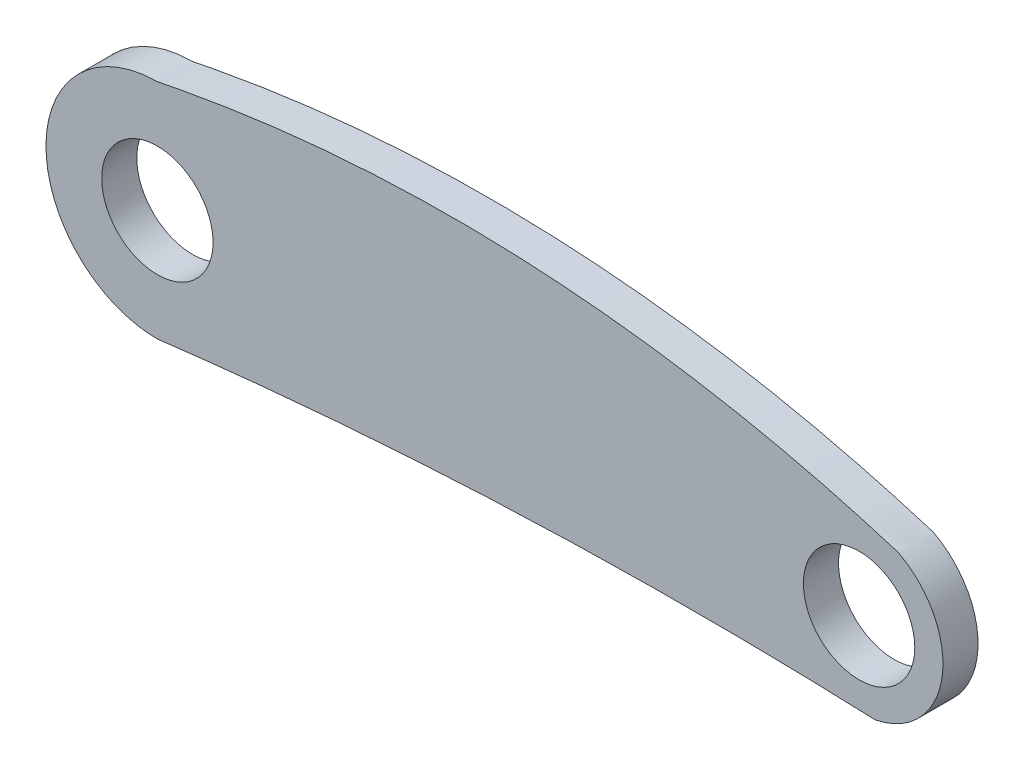
ISO-10303-21;
HEADER;
FILE_DESCRIPTION(('STEP AP214'),'2;1');
FILE_NAME('part.step','',(''),(''),'','','');
FILE_SCHEMA(('AUTOMOTIVE_DESIGN { 1 0 10303 214 1 1 1 1 }'));
ENDSEC;
DATA;
#1=APPLICATION_CONTEXT('core data for automotive mechanical design processes');
#2=APPLICATION_PROTOCOL_DEFINITION('international standard','automotive_design',2000,#1);
#3=PRODUCT_CONTEXT('',#1,'mechanical');
#4=PRODUCT('Part','Part','',(#3));
#5=PRODUCT_RELATED_PRODUCT_CATEGORY('part','',(#4));
#6=PRODUCT_DEFINITION_FORMATION('','',#4);
#7=PRODUCT_DEFINITION_CONTEXT('part definition',#1,'design');
#8=PRODUCT_DEFINITION('design','',#6,#7);
#9=PRODUCT_DEFINITION_SHAPE('','',#8);
#10=(LENGTH_UNIT() NAMED_UNIT(*) SI_UNIT(.MILLI.,.METRE.));
#11=(NAMED_UNIT(*) PLANE_ANGLE_UNIT() SI_UNIT($,.RADIAN.));
#12=(NAMED_UNIT(*) SI_UNIT($,.STERADIAN.) SOLID_ANGLE_UNIT());
#13=UNCERTAINTY_MEASURE_WITH_UNIT(LENGTH_MEASURE(1.E-05),#10,'distance_accuracy_value','');
#14=(GEOMETRIC_REPRESENTATION_CONTEXT(3) GLOBAL_UNCERTAINTY_ASSIGNED_CONTEXT((#13)) GLOBAL_UNIT_ASSIGNED_CONTEXT((#10,
#11,#12)) REPRESENTATION_CONTEXT('',''));
#15=CARTESIAN_POINT('',(0.,0.,0.));
#16=DIRECTION('',(0.,0.,1.));
#17=DIRECTION('',(1.,0.,0.));
#18=AXIS2_PLACEMENT_3D('',#15,#16,#17);
#19=CARTESIAN_POINT('',(-1.27524154331553,6.22063172083047,2.));
#20=DIRECTION('',(0.,0.,-1.));
#21=DIRECTION('',(-1.,0.,0.));
#22=AXIS2_PLACEMENT_3D('',#19,#20,#21);
#23=PLANE('',#22);
#24=CARTESIAN_POINT('',(40.9118577922358,-4.69407127594518,2.));
#25=CARTESIAN_POINT('',(40.9118994416332,-4.69407298212478,2.));
#26=CARTESIAN_POINT('',(40.9119827404271,-4.69407639450467,2.));
#27=CARTESIAN_POINT('',(40.9121090998265,-4.69406649128909,2.));
#28=CARTESIAN_POINT('',(40.9121909376222,-4.69405058818864,2.));
#29=CARTESIAN_POINT('',(40.912231856416,-4.69404263610338,2.));
#30=CARTESIAN_POINT('',(46.2302302810798,-3.66055232691103,2.));
#31=CARTESIAN_POINT('',(47.0235592612382,1.69853701673326,2.));
#32=CARTESIAN_POINT('',(42.2330638987091,4.22843101560126,2.));
#33=CARTESIAN_POINT('',(42.2330269728172,4.22845051642221,2.));
#34=CARTESIAN_POINT('',(42.2329531205225,4.22848951709672,2.));
#35=CARTESIAN_POINT('',(42.2328365597031,4.22853824426454,2.));
#36=CARTESIAN_POINT('',(42.2327568195201,4.22856307805718,2.));
#37=CARTESIAN_POINT('',(42.2327169494194,4.22857549492409,2.));
#38=CARTESIAN_POINT('',(28.4861985734922,8.5096955877096,2.));
#39=CARTESIAN_POINT('',(14.106595340151,9.23203038559607,2.));
#40=CARTESIAN_POINT('',(0.000250914794278773,6.35005126322871,2.));
#41=CARTESIAN_POINT('',(0.000194731492172305,6.35003978476918,2.));
#42=CARTESIAN_POINT('',(8.23649112216448E-05,6.35001682773624,2.));
#43=CARTESIAN_POINT('',(-9.05955573304217E-05,6.35000000013051,2.));
#44=CARTESIAN_POINT('',(-0.000205283280596354,6.34999999694072,2.));
#45=CARTESIAN_POINT('',(-0.000262627142197194,6.34999999456906,2.));
#46=CARTESIAN_POINT('',(-12.6991068699152,6.34947478808472,2.));
#47=CARTESIAN_POINT('',(-12.6991595300393,-6.34936946544,2.));
#48=CARTESIAN_POINT('',(-0.000315292058983441,-6.34999999217251,2.));
#49=CARTESIAN_POINT('',(-0.000246246660934496,-6.34999999560078,2.));
#50=CARTESIAN_POINT('',(-0.000108155864724777,-6.35000000020505,2.));
#51=CARTESIAN_POINT('',(9.93932082512718E-05,-6.34998782870481,2.));
#52=CARTESIAN_POINT('',(0.000236460151858655,-6.34997104415882,2.));
#53=CARTESIAN_POINT('',(0.000304993627114197,-6.34996265191401,2.));
#54=CARTESIAN_POINT('',(13.5774292440651,-4.68738024164178,2.));
#55=CARTESIAN_POINT('',(27.2447797479319,-4.13419547392832,2.));
#56=CARTESIAN_POINT('',(40.9118577922358,-4.69407127594518,2.));
#57=(BOUNDED_CURVE() B_SPLINE_CURVE(3,(#24,#25,#26,#27,#28,#29,#30,#31,#32,#33,#34,#35,#36,#37,
#38,#39,#40,#41,#42,#43,#44,#45,#46,#47,#48,#49,#50,#51,#52,#53,#54,#55,#56),.UNSPECIFIED.,.T.,
.F.) B_SPLINE_CURVE_WITH_KNOTS((4,1,1,3,3,1,1,3,3,1,1,3,3,1,1,3,4),(0.,1.19152142252776E-06,
2.38304284494451E-06,3.57456426747227E-06,0.085944545826782,0.0859457394789892,
0.0859469331311964,0.0859481267834036,0.488852029312329,0.488853668452023,0.488855307591717,
0.488856946731411,0.60986422630171,0.609866199922766,0.609868173543822,0.609870147164878,1.),
.UNSPECIFIED.) CURVE() GEOMETRIC_REPRESENTATION_ITEM() RATIONAL_B_SPLINE_CURVE((1.,1.,1.,1.,1.,
1.,0.554974491595071,0.554974491595071,1.,1.,1.,1.,1.,1.,0.978990063200607,0.978990063200607,1.,
1.,1.,1.,1.,1.,0.333363670299275,0.333363670299275,1.,1.,1.,1.,1.,1.,0.997792824757413,
0.997792824757413,1.)) REPRESENTATION_ITEM(''));
#58=CARTESIAN_POINT('',(40.9118577922358,-4.69407127594518,2.));
#59=VERTEX_POINT('',#58);
#60=EDGE_CURVE('E10',#59,#59,#57,.T.);
#61=ORIENTED_EDGE('',*,*,#60,.T.);
#62=EDGE_LOOP('',(#61));
#63=FACE_BOUND('',#62,.T.);
#64=CARTESIAN_POINT('',(40.,0.,2.));
#65=DIRECTION('',(0.,0.,1.));
#66=DIRECTION('',(1.,0.,0.));
#67=AXIS2_PLACEMENT_3D('',#64,#65,#66);
#68=CIRCLE('',#67,3.17500000000001);
#69=CARTESIAN_POINT('',(43.175,0.,2.));
#70=VERTEX_POINT('',#69);
#71=EDGE_CURVE('E44',#70,#70,#68,.T.);
#72=ORIENTED_EDGE('',*,*,#71,.F.);
#73=EDGE_LOOP('',(#72));
#74=FACE_BOUND('',#73,.T.);
#75=CARTESIAN_POINT('',(0.,0.,2.));
#76=DIRECTION('',(0.,0.,1.));
#77=DIRECTION('',(1.,0.,0.));
#78=AXIS2_PLACEMENT_3D('',#75,#76,#77);
#79=CIRCLE('',#78,3.175);
#80=CARTESIAN_POINT('',(3.175,0.,2.));
#81=VERTEX_POINT('',#80);
#82=EDGE_CURVE('E55',#81,#81,#79,.T.);
#83=ORIENTED_EDGE('',*,*,#82,.F.);
#84=EDGE_LOOP('',(#83));
#85=FACE_BOUND('',#84,.T.);
#86=ADVANCED_FACE('F31',(#63,#74,#85),#23,.F.);
#87=CARTESIAN_POINT('',(-1.27524154331553,6.22063172083047,0.));
#88=DIRECTION('',(0.,0.,-1.));
#89=DIRECTION('',(-1.,0.,0.));
#90=AXIS2_PLACEMENT_3D('',#87,#88,#89);
#91=PLANE('',#90);
#92=CARTESIAN_POINT('',(40.,0.,0.));
#93=DIRECTION('',(0.,0.,1.));
#94=DIRECTION('',(1.,0.,0.));
#95=AXIS2_PLACEMENT_3D('',#92,#93,#94);
#96=CIRCLE('',#95,3.17500000000001);
#97=CARTESIAN_POINT('',(43.175,0.,0.));
#98=VERTEX_POINT('',#97);
#99=EDGE_CURVE('E49',#98,#98,#96,.T.);
#100=ORIENTED_EDGE('',*,*,#99,.T.);
#101=EDGE_LOOP('',(#100));
#102=FACE_BOUND('',#101,.T.);
#103=CARTESIAN_POINT('',(40.9118577922358,-4.69407127594518,0.));
#104=CARTESIAN_POINT('',(40.9118994416332,-4.69407298212478,0.));
#105=CARTESIAN_POINT('',(40.9119827404271,-4.69407639450467,0.));
#106=CARTESIAN_POINT('',(40.9121090998265,-4.69406649128909,0.));
#107=CARTESIAN_POINT('',(40.9121909376222,-4.69405058818864,0.));
#108=CARTESIAN_POINT('',(40.912231856416,-4.69404263610338,0.));
#109=CARTESIAN_POINT('',(46.2302302810798,-3.66055232691103,0.));
#110=CARTESIAN_POINT('',(47.0235592612382,1.69853701673326,0.));
#111=CARTESIAN_POINT('',(42.2330638987091,4.22843101560126,0.));
#112=CARTESIAN_POINT('',(42.2330269728172,4.22845051642221,0.));
#113=CARTESIAN_POINT('',(42.2329531205225,4.22848951709672,0.));
#114=CARTESIAN_POINT('',(42.2328365597031,4.22853824426454,0.));
#115=CARTESIAN_POINT('',(42.2327568195201,4.22856307805718,0.));
#116=CARTESIAN_POINT('',(42.2327169494194,4.22857549492409,0.));
#117=CARTESIAN_POINT('',(28.4861985734922,8.5096955877096,0.));
#118=CARTESIAN_POINT('',(14.106595340151,9.23203038559607,0.));
#119=CARTESIAN_POINT('',(0.000250914794278773,6.35005126322871,0.));
#120=CARTESIAN_POINT('',(0.000194731492172305,6.35003978476918,0.));
#121=CARTESIAN_POINT('',(8.23649112216448E-05,6.35001682773624,0.));
#122=CARTESIAN_POINT('',(-9.05955573304217E-05,6.35000000013051,0.));
#123=CARTESIAN_POINT('',(-0.000205283280596354,6.34999999694072,0.));
#124=CARTESIAN_POINT('',(-0.000262627142197194,6.34999999456906,0.));
#125=CARTESIAN_POINT('',(-12.6991068699152,6.34947478808472,0.));
#126=CARTESIAN_POINT('',(-12.6991595300393,-6.34936946544,0.));
#127=CARTESIAN_POINT('',(-0.000315292058983441,-6.34999999217251,0.));
#128=CARTESIAN_POINT('',(-0.000246246660934496,-6.34999999560078,0.));
#129=CARTESIAN_POINT('',(-0.000108155864724777,-6.35000000020505,0.));
#130=CARTESIAN_POINT('',(9.93932082512718E-05,-6.34998782870481,0.));
#131=CARTESIAN_POINT('',(0.000236460151858655,-6.34997104415882,0.));
#132=CARTESIAN_POINT('',(0.000304993627114197,-6.34996265191401,0.));
#133=CARTESIAN_POINT('',(13.5774292440651,-4.68738024164178,0.));
#134=CARTESIAN_POINT('',(27.2447797479319,-4.13419547392832,0.));
#135=CARTESIAN_POINT('',(40.9118577922358,-4.69407127594518,0.));
#136=(BOUNDED_CURVE() B_SPLINE_CURVE(3,(#103,#104,#105,#106,#107,#108,#109,#110,#111,#112,#113,
#114,#115,#116,#117,#118,#119,#120,#121,#122,#123,#124,#125,#126,#127,#128,#129,#130,#131,#132,
#133,#134,#135),.UNSPECIFIED.,.T.,.F.) B_SPLINE_CURVE_WITH_KNOTS((4,1,1,3,3,1,1,3,3,1,1,3,3,1,1,
3,4),(0.,1.19152142252776E-06,2.38304284494451E-06,3.57456426747227E-06,0.085944545826782,
0.0859457394789892,0.0859469331311964,0.0859481267834036,0.488852029312329,0.488853668452023,
0.488855307591717,0.488856946731411,0.60986422630171,0.609866199922766,0.609868173543822,
0.609870147164878,1.),
.UNSPECIFIED.) CURVE() GEOMETRIC_REPRESENTATION_ITEM() RATIONAL_B_SPLINE_CURVE((1.,1.,1.,1.,1.,
1.,0.554974491595071,0.554974491595071,1.,1.,1.,1.,1.,1.,0.978990063200607,0.978990063200607,1.,
1.,1.,1.,1.,1.,0.333363670299275,0.333363670299275,1.,1.,1.,1.,1.,1.,0.997792824757413,
0.997792824757413,1.)) REPRESENTATION_ITEM(''));
#137=CARTESIAN_POINT('',(40.9118577922358,-4.69407127594518,0.));
#138=VERTEX_POINT('',#137);
#139=EDGE_CURVE('E36',#138,#138,#136,.T.);
#140=ORIENTED_EDGE('',*,*,#139,.F.);
#141=EDGE_LOOP('',(#140));
#142=FACE_BOUND('',#141,.T.);
#143=CARTESIAN_POINT('',(0.,0.,0.));
#144=DIRECTION('',(0.,0.,1.));
#145=DIRECTION('',(1.,0.,0.));
#146=AXIS2_PLACEMENT_3D('',#143,#144,#145);
#147=CIRCLE('',#146,3.175);
#148=CARTESIAN_POINT('',(3.175,0.,0.));
#149=VERTEX_POINT('',#148);
#150=EDGE_CURVE('E58',#149,#149,#147,.T.);
#151=ORIENTED_EDGE('',*,*,#150,.T.);
#152=EDGE_LOOP('',(#151));
#153=FACE_BOUND('',#152,.T.);
#154=ADVANCED_FACE('F68',(#102,#142,#153),#91,.T.);
#155=DIRECTION('',(0.,0.,-1.));
#156=VECTOR('',#155,1.);
#157=SURFACE_OF_LINEAR_EXTRUSION('',#57,#156);
#158=ORIENTED_EDGE('',*,*,#60,.F.);
#159=EDGE_LOOP('',(#158));
#160=FACE_BOUND('',#159,.T.);
#161=ORIENTED_EDGE('',*,*,#139,.T.);
#162=EDGE_LOOP('',(#161));
#163=FACE_BOUND('',#162,.T.);
#164=ADVANCED_FACE('F33',(#160,#163),#157,.F.);
#165=CARTESIAN_POINT('',(40.,0.,2.));
#166=DIRECTION('',(0.,0.,-1.));
#167=DIRECTION('',(-1.,0.,0.));
#168=AXIS2_PLACEMENT_3D('',#165,#166,#167);
#169=CYLINDRICAL_SURFACE('',#168,3.17500000000001);
#170=ORIENTED_EDGE('',*,*,#71,.T.);
#171=EDGE_LOOP('',(#170));
#172=FACE_BOUND('',#171,.T.);
#173=ORIENTED_EDGE('',*,*,#99,.F.);
#174=EDGE_LOOP('',(#173));
#175=FACE_BOUND('',#174,.T.);
#176=ADVANCED_FACE('F76',(#172,#175),#169,.F.);
#177=CARTESIAN_POINT('',(0.,0.,2.));
#178=DIRECTION('',(0.,0.,-1.));
#179=DIRECTION('',(-1.,0.,0.));
#180=AXIS2_PLACEMENT_3D('',#177,#178,#179);
#181=CYLINDRICAL_SURFACE('',#180,3.175);
#182=ORIENTED_EDGE('',*,*,#82,.T.);
#183=EDGE_LOOP('',(#182));
#184=FACE_BOUND('',#183,.T.);
#185=ORIENTED_EDGE('',*,*,#150,.F.);
#186=EDGE_LOOP('',(#185));
#187=FACE_BOUND('',#186,.T.);
#188=ADVANCED_FACE('F64',(#184,#187),#181,.F.);
#189=CLOSED_SHELL('',(#86,#154,#164,#176,#188));
#190=MANIFOLD_SOLID_BREP('B2',#189);
#191=ADVANCED_BREP_SHAPE_REPRESENTATION('',(#18,#190),#14);
#192=SHAPE_DEFINITION_REPRESENTATION(#9,#191);
ENDSEC;
END-ISO-10303-21;
